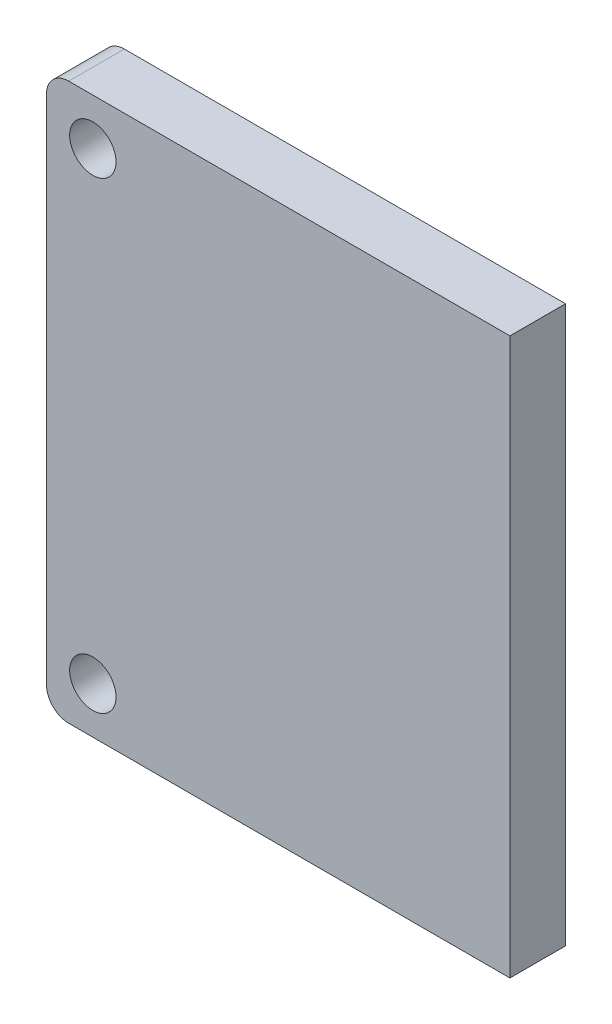
ISO-10303-21;
HEADER;
FILE_DESCRIPTION(('STEP AP214'),'2;1');
FILE_NAME('part.step','',(''),(''),'','','');
FILE_SCHEMA(('AUTOMOTIVE_DESIGN { 1 0 10303 214 1 1 1 1 }'));
ENDSEC;
DATA;
#1=APPLICATION_CONTEXT('core data for automotive mechanical design processes');
#2=APPLICATION_PROTOCOL_DEFINITION('international standard','automotive_design',2000,#1);
#3=PRODUCT_CONTEXT('',#1,'mechanical');
#4=PRODUCT('Part','Part','',(#3));
#5=PRODUCT_RELATED_PRODUCT_CATEGORY('part','',(#4));
#6=PRODUCT_DEFINITION_FORMATION('','',#4);
#7=PRODUCT_DEFINITION_CONTEXT('part definition',#1,'design');
#8=PRODUCT_DEFINITION('design','',#6,#7);
#9=PRODUCT_DEFINITION_SHAPE('','',#8);
#10=(LENGTH_UNIT() NAMED_UNIT(*) SI_UNIT(.MILLI.,.METRE.));
#11=(NAMED_UNIT(*) PLANE_ANGLE_UNIT() SI_UNIT($,.RADIAN.));
#12=(NAMED_UNIT(*) SI_UNIT($,.STERADIAN.) SOLID_ANGLE_UNIT());
#13=UNCERTAINTY_MEASURE_WITH_UNIT(LENGTH_MEASURE(1.E-05),#10,'distance_accuracy_value','');
#14=(GEOMETRIC_REPRESENTATION_CONTEXT(3) GLOBAL_UNCERTAINTY_ASSIGNED_CONTEXT((#13)) GLOBAL_UNIT_ASSIGNED_CONTEXT((#10,
#11,#12)) REPRESENTATION_CONTEXT('',''));
#15=CARTESIAN_POINT('',(0.,0.,0.));
#16=DIRECTION('',(0.,0.,1.));
#17=DIRECTION('',(1.,0.,0.));
#18=AXIS2_PLACEMENT_3D('',#15,#16,#17);
#19=CARTESIAN_POINT('',(1.198391603743,1.198391603743,3.));
#20=DIRECTION('',(0.,0.,1.));
#21=DIRECTION('',(1.,0.,0.));
#22=AXIS2_PLACEMENT_3D('',#19,#20,#21);
#23=PLANE('',#22);
#24=CARTESIAN_POINT('',(2.5,2.5,3.));
#25=DIRECTION('',(0.,0.,1.));
#26=DIRECTION('',(1.,0.,0.));
#27=AXIS2_PLACEMENT_3D('',#24,#25,#26);
#28=CIRCLE('',#27,1.25);
#29=CARTESIAN_POINT('',(3.75,2.5,3.));
#30=VERTEX_POINT('',#29);
#31=EDGE_CURVE('E128',#30,#30,#28,.T.);
#32=ORIENTED_EDGE('',*,*,#31,.F.);
#33=EDGE_LOOP('',(#32));
#34=FACE_BOUND('',#33,.T.);
#35=CARTESIAN_POINT('',(1.198391603743,1.198391603743,3.));
#36=DIRECTION('',(0.,0.,1.));
#37=DIRECTION('',(1.,0.,0.));
#38=AXIS2_PLACEMENT_3D('',#35,#36,#37);
#39=CIRCLE('',#38,1.19839268314423);
#40=CARTESIAN_POINT('',(0.,1.200000047684,3.));
#41=VERTEX_POINT('',#40);
#42=CARTESIAN_POINT('',(1.200000047684,0.,3.));
#43=VERTEX_POINT('',#42);
#44=EDGE_CURVE('E135',#41,#43,#39,.T.);
#45=ORIENTED_EDGE('',*,*,#44,.T.);
#46=DIRECTION('',(1.,0.,0.));
#47=VECTOR('',#46,1.);
#48=CARTESIAN_POINT('',(1.200000047684,0.,3.));
#49=LINE('',#48,#47);
#50=CARTESIAN_POINT('',(24.9999996423725,0.,3.));
#51=VERTEX_POINT('',#50);
#52=EDGE_CURVE('E93',#43,#51,#49,.T.);
#53=ORIENTED_EDGE('',*,*,#52,.T.);
#54=DIRECTION('',(0.,1.,0.));
#55=VECTOR('',#54,1.);
#56=CARTESIAN_POINT('',(24.9999996423725,30.,3.));
#57=LINE('',#56,#55);
#58=CARTESIAN_POINT('',(24.9999996423725,30.,3.));
#59=VERTEX_POINT('',#58);
#60=EDGE_CURVE('E106',#51,#59,#57,.T.);
#61=ORIENTED_EDGE('',*,*,#60,.T.);
#62=DIRECTION('',(-1.,0.,0.));
#63=VECTOR('',#62,1.);
#64=CARTESIAN_POINT('',(24.9999996423725,30.,3.));
#65=LINE('',#64,#63);
#66=CARTESIAN_POINT('',(1.200000047684,30.,3.));
#67=VERTEX_POINT('',#66);
#68=EDGE_CURVE('E100',#59,#67,#65,.T.);
#69=ORIENTED_EDGE('',*,*,#68,.T.);
#70=CARTESIAN_POINT('',(1.198391300151,28.80160869889,3.));
#71=DIRECTION('',(0.,0.,1.));
#72=DIRECTION('',(1.,0.,0.));
#73=AXIS2_PLACEMENT_3D('',#70,#71,#72);
#74=CIRCLE('',#73,1.19839238091906);
#75=CARTESIAN_POINT('',(0.,28.799999237061,3.));
#76=VERTEX_POINT('',#75);
#77=EDGE_CURVE('E104',#67,#76,#74,.T.);
#78=ORIENTED_EDGE('',*,*,#77,.T.);
#79=DIRECTION('',(0.,-1.,0.));
#80=VECTOR('',#79,1.);
#81=CARTESIAN_POINT('',(0.,28.799999237061,3.));
#82=LINE('',#81,#80);
#83=EDGE_CURVE('E56',#76,#41,#82,.T.);
#84=ORIENTED_EDGE('',*,*,#83,.T.);
#85=EDGE_LOOP('',(#45,#53,#61,#69,#78,#84));
#86=FACE_BOUND('',#85,.T.);
#87=CARTESIAN_POINT('',(2.5,27.5,3.));
#88=DIRECTION('',(0.,0.,1.));
#89=DIRECTION('',(1.,0.,0.));
#90=AXIS2_PLACEMENT_3D('',#87,#88,#89);
#91=CIRCLE('',#90,1.25);
#92=CARTESIAN_POINT('',(3.75,27.5,3.));
#93=VERTEX_POINT('',#92);
#94=EDGE_CURVE('E177',#93,#93,#91,.T.);
#95=ORIENTED_EDGE('',*,*,#94,.F.);
#96=EDGE_LOOP('',(#95));
#97=FACE_BOUND('',#96,.T.);
#98=ADVANCED_FACE('F39',(#34,#86,#97),#23,.T.);
#99=CARTESIAN_POINT('',(1.198391603743,1.198391603743,0.));
#100=DIRECTION('',(0.,0.,1.));
#101=DIRECTION('',(1.,0.,0.));
#102=AXIS2_PLACEMENT_3D('',#99,#100,#101);
#103=PLANE('',#102);
#104=CARTESIAN_POINT('',(1.198391603743,1.198391603743,0.));
#105=DIRECTION('',(0.,0.,1.));
#106=DIRECTION('',(1.,0.,0.));
#107=AXIS2_PLACEMENT_3D('',#104,#105,#106);
#108=CIRCLE('',#107,1.19839268314423);
#109=CARTESIAN_POINT('',(0.,1.200000047684,0.));
#110=VERTEX_POINT('',#109);
#111=CARTESIAN_POINT('',(1.200000047684,0.,0.));
#112=VERTEX_POINT('',#111);
#113=EDGE_CURVE('E124',#110,#112,#108,.T.);
#114=ORIENTED_EDGE('',*,*,#113,.F.);
#115=DIRECTION('',(0.,-1.,0.));
#116=VECTOR('',#115,1.);
#117=CARTESIAN_POINT('',(0.,28.799999237061,0.));
#118=LINE('',#117,#116);
#119=CARTESIAN_POINT('',(0.,28.799999237061,0.));
#120=VERTEX_POINT('',#119);
#121=EDGE_CURVE('E85',#120,#110,#118,.T.);
#122=ORIENTED_EDGE('',*,*,#121,.F.);
#123=CARTESIAN_POINT('',(1.198391300151,28.80160869889,0.));
#124=DIRECTION('',(0.,0.,1.));
#125=DIRECTION('',(1.,0.,0.));
#126=AXIS2_PLACEMENT_3D('',#123,#124,#125);
#127=CIRCLE('',#126,1.19839238091906);
#128=CARTESIAN_POINT('',(1.200000047684,30.,0.));
#129=VERTEX_POINT('',#128);
#130=EDGE_CURVE('E79',#129,#120,#127,.T.);
#131=ORIENTED_EDGE('',*,*,#130,.F.);
#132=DIRECTION('',(-1.,0.,0.));
#133=VECTOR('',#132,1.);
#134=CARTESIAN_POINT('',(24.9999996423725,30.,0.));
#135=LINE('',#134,#133);
#136=CARTESIAN_POINT('',(24.9999996423725,30.,0.));
#137=VERTEX_POINT('',#136);
#138=EDGE_CURVE('E114',#137,#129,#135,.T.);
#139=ORIENTED_EDGE('',*,*,#138,.F.);
#140=DIRECTION('',(0.,1.,0.));
#141=VECTOR('',#140,1.);
#142=CARTESIAN_POINT('',(24.9999996423725,30.,0.));
#143=LINE('',#142,#141);
#144=CARTESIAN_POINT('',(24.9999996423725,0.,0.));
#145=VERTEX_POINT('',#144);
#146=EDGE_CURVE('E130',#145,#137,#143,.T.);
#147=ORIENTED_EDGE('',*,*,#146,.F.);
#148=DIRECTION('',(1.,0.,0.));
#149=VECTOR('',#148,1.);
#150=CARTESIAN_POINT('',(1.200000047684,0.,0.));
#151=LINE('',#150,#149);
#152=EDGE_CURVE('E127',#112,#145,#151,.T.);
#153=ORIENTED_EDGE('',*,*,#152,.F.);
#154=EDGE_LOOP('',(#114,#122,#131,#139,#147,#153));
#155=FACE_BOUND('',#154,.T.);
#156=CARTESIAN_POINT('',(2.5,2.5,0.));
#157=DIRECTION('',(0.,0.,1.));
#158=DIRECTION('',(1.,0.,0.));
#159=AXIS2_PLACEMENT_3D('',#156,#157,#158);
#160=CIRCLE('',#159,1.25);
#161=CARTESIAN_POINT('',(3.75,2.5,0.));
#162=VERTEX_POINT('',#161);
#163=EDGE_CURVE('E183',#162,#162,#160,.T.);
#164=ORIENTED_EDGE('',*,*,#163,.T.);
#165=EDGE_LOOP('',(#164));
#166=FACE_BOUND('',#165,.T.);
#167=CARTESIAN_POINT('',(2.5,27.5,0.));
#168=DIRECTION('',(0.,0.,1.));
#169=DIRECTION('',(1.,0.,0.));
#170=AXIS2_PLACEMENT_3D('',#167,#168,#169);
#171=CIRCLE('',#170,1.25);
#172=CARTESIAN_POINT('',(3.75,27.5,0.));
#173=VERTEX_POINT('',#172);
#174=EDGE_CURVE('E180',#173,#173,#171,.T.);
#175=ORIENTED_EDGE('',*,*,#174,.T.);
#176=EDGE_LOOP('',(#175));
#177=FACE_BOUND('',#176,.T.);
#178=ADVANCED_FACE('F144',(#155,#166,#177),#103,.F.);
#179=CARTESIAN_POINT('',(1.198391603743,1.198391603743,3.));
#180=DIRECTION('',(0.,0.,-1.));
#181=DIRECTION('',(-1.,0.,0.));
#182=AXIS2_PLACEMENT_3D('',#179,#180,#181);
#183=CYLINDRICAL_SURFACE('',#182,1.19839268314423);
#184=ORIENTED_EDGE('',*,*,#113,.T.);
#185=DIRECTION('',(0.,0.,-1.));
#186=VECTOR('',#185,1.);
#187=CARTESIAN_POINT('',(1.200000047684,0.,3.));
#188=LINE('',#187,#186);
#189=EDGE_CURVE('E11',#43,#112,#188,.T.);
#190=ORIENTED_EDGE('',*,*,#189,.F.);
#191=ORIENTED_EDGE('',*,*,#44,.F.);
#192=DIRECTION('',(0.,0.,-1.));
#193=VECTOR('',#192,1.);
#194=CARTESIAN_POINT('',(0.,1.200000047684,3.));
#195=LINE('',#194,#193);
#196=EDGE_CURVE('E120',#41,#110,#195,.T.);
#197=ORIENTED_EDGE('',*,*,#196,.T.);
#198=EDGE_LOOP('',(#184,#190,#191,#197));
#199=FACE_BOUND('',#198,.T.);
#200=ADVANCED_FACE('F41',(#199),#183,.T.);
#201=CARTESIAN_POINT('',(1.200000047684,0.,3.));
#202=DIRECTION('',(0.,1.,0.));
#203=DIRECTION('',(-1.,0.,0.));
#204=AXIS2_PLACEMENT_3D('',#201,#202,#203);
#205=PLANE('',#204);
#206=ORIENTED_EDGE('',*,*,#152,.T.);
#207=DIRECTION('',(0.,0.,-1.));
#208=VECTOR('',#207,1.);
#209=CARTESIAN_POINT('',(24.9999996423725,0.,3.));
#210=LINE('',#209,#208);
#211=EDGE_CURVE('E48',#51,#145,#210,.T.);
#212=ORIENTED_EDGE('',*,*,#211,.F.);
#213=ORIENTED_EDGE('',*,*,#52,.F.);
#214=ORIENTED_EDGE('',*,*,#189,.T.);
#215=EDGE_LOOP('',(#206,#212,#213,#214));
#216=FACE_BOUND('',#215,.T.);
#217=ADVANCED_FACE('F224',(#216),#205,.F.);
#218=CARTESIAN_POINT('',(24.9999996423725,30.,3.));
#219=DIRECTION('',(-1.,0.,0.));
#220=DIRECTION('',(0.,-1.,0.));
#221=AXIS2_PLACEMENT_3D('',#218,#219,#220);
#222=PLANE('',#221);
#223=ORIENTED_EDGE('',*,*,#146,.T.);
#224=DIRECTION('',(0.,0.,-1.));
#225=VECTOR('',#224,1.);
#226=CARTESIAN_POINT('',(24.9999996423725,30.,3.));
#227=LINE('',#226,#225);
#228=EDGE_CURVE('E115',#59,#137,#227,.T.);
#229=ORIENTED_EDGE('',*,*,#228,.F.);
#230=ORIENTED_EDGE('',*,*,#60,.F.);
#231=ORIENTED_EDGE('',*,*,#211,.T.);
#232=EDGE_LOOP('',(#223,#229,#230,#231));
#233=FACE_BOUND('',#232,.T.);
#234=ADVANCED_FACE('F141',(#233),#222,.F.);
#235=CARTESIAN_POINT('',(24.9999996423725,30.,3.));
#236=DIRECTION('',(0.,-1.,0.));
#237=DIRECTION('',(0.,0.,-1.));
#238=AXIS2_PLACEMENT_3D('',#235,#236,#237);
#239=PLANE('',#238);
#240=ORIENTED_EDGE('',*,*,#138,.T.);
#241=DIRECTION('',(0.,0.,-1.));
#242=VECTOR('',#241,1.);
#243=CARTESIAN_POINT('',(1.200000047684,30.,3.));
#244=LINE('',#243,#242);
#245=EDGE_CURVE('E111',#67,#129,#244,.T.);
#246=ORIENTED_EDGE('',*,*,#245,.F.);
#247=ORIENTED_EDGE('',*,*,#68,.F.);
#248=ORIENTED_EDGE('',*,*,#228,.T.);
#249=EDGE_LOOP('',(#240,#246,#247,#248));
#250=FACE_BOUND('',#249,.T.);
#251=ADVANCED_FACE('F112',(#250),#239,.F.);
#252=CARTESIAN_POINT('',(1.198391300151,28.80160869889,3.));
#253=DIRECTION('',(0.,0.,-1.));
#254=DIRECTION('',(-1.,0.,0.));
#255=AXIS2_PLACEMENT_3D('',#252,#253,#254);
#256=CYLINDRICAL_SURFACE('',#255,1.19839238091906);
#257=ORIENTED_EDGE('',*,*,#130,.T.);
#258=DIRECTION('',(0.,0.,-1.));
#259=VECTOR('',#258,1.);
#260=CARTESIAN_POINT('',(0.,28.799999237061,3.));
#261=LINE('',#260,#259);
#262=EDGE_CURVE('E116',#76,#120,#261,.T.);
#263=ORIENTED_EDGE('',*,*,#262,.F.);
#264=ORIENTED_EDGE('',*,*,#77,.F.);
#265=ORIENTED_EDGE('',*,*,#245,.T.);
#266=EDGE_LOOP('',(#257,#263,#264,#265));
#267=FACE_BOUND('',#266,.T.);
#268=ADVANCED_FACE('F118',(#267),#256,.T.);
#269=CARTESIAN_POINT('',(0.,28.799999237061,3.));
#270=DIRECTION('',(1.,0.,0.));
#271=DIRECTION('',(0.,1.,0.));
#272=AXIS2_PLACEMENT_3D('',#269,#270,#271);
#273=PLANE('',#272);
#274=ORIENTED_EDGE('',*,*,#121,.T.);
#275=ORIENTED_EDGE('',*,*,#196,.F.);
#276=ORIENTED_EDGE('',*,*,#83,.F.);
#277=ORIENTED_EDGE('',*,*,#262,.T.);
#278=EDGE_LOOP('',(#274,#275,#276,#277));
#279=FACE_BOUND('',#278,.T.);
#280=ADVANCED_FACE('F149',(#279),#273,.F.);
#281=CARTESIAN_POINT('',(2.5,2.5,3.));
#282=DIRECTION('',(0.,0.,-1.));
#283=DIRECTION('',(-1.,0.,0.));
#284=AXIS2_PLACEMENT_3D('',#281,#282,#283);
#285=CYLINDRICAL_SURFACE('',#284,1.25);
#286=ORIENTED_EDGE('',*,*,#31,.T.);
#287=EDGE_LOOP('',(#286));
#288=FACE_BOUND('',#287,.T.);
#289=ORIENTED_EDGE('',*,*,#163,.F.);
#290=EDGE_LOOP('',(#289));
#291=FACE_BOUND('',#290,.T.);
#292=ADVANCED_FACE('F151',(#288,#291),#285,.F.);
#293=CARTESIAN_POINT('',(2.5,27.5,3.));
#294=DIRECTION('',(0.,0.,-1.));
#295=DIRECTION('',(-1.,0.,0.));
#296=AXIS2_PLACEMENT_3D('',#293,#294,#295);
#297=CYLINDRICAL_SURFACE('',#296,1.25);
#298=ORIENTED_EDGE('',*,*,#94,.T.);
#299=EDGE_LOOP('',(#298));
#300=FACE_BOUND('',#299,.T.);
#301=ORIENTED_EDGE('',*,*,#174,.F.);
#302=EDGE_LOOP('',(#301));
#303=FACE_BOUND('',#302,.T.);
#304=ADVANCED_FACE('F157',(#300,#303),#297,.F.);
#305=CLOSED_SHELL('',(#98,#178,#200,#217,#234,#251,#268,#280,#292,#304));
#306=MANIFOLD_SOLID_BREP('B2',#305);
#307=ADVANCED_BREP_SHAPE_REPRESENTATION('',(#18,#306),#14);
#308=SHAPE_DEFINITION_REPRESENTATION(#9,#307);
ENDSEC;
END-ISO-10303-21;
